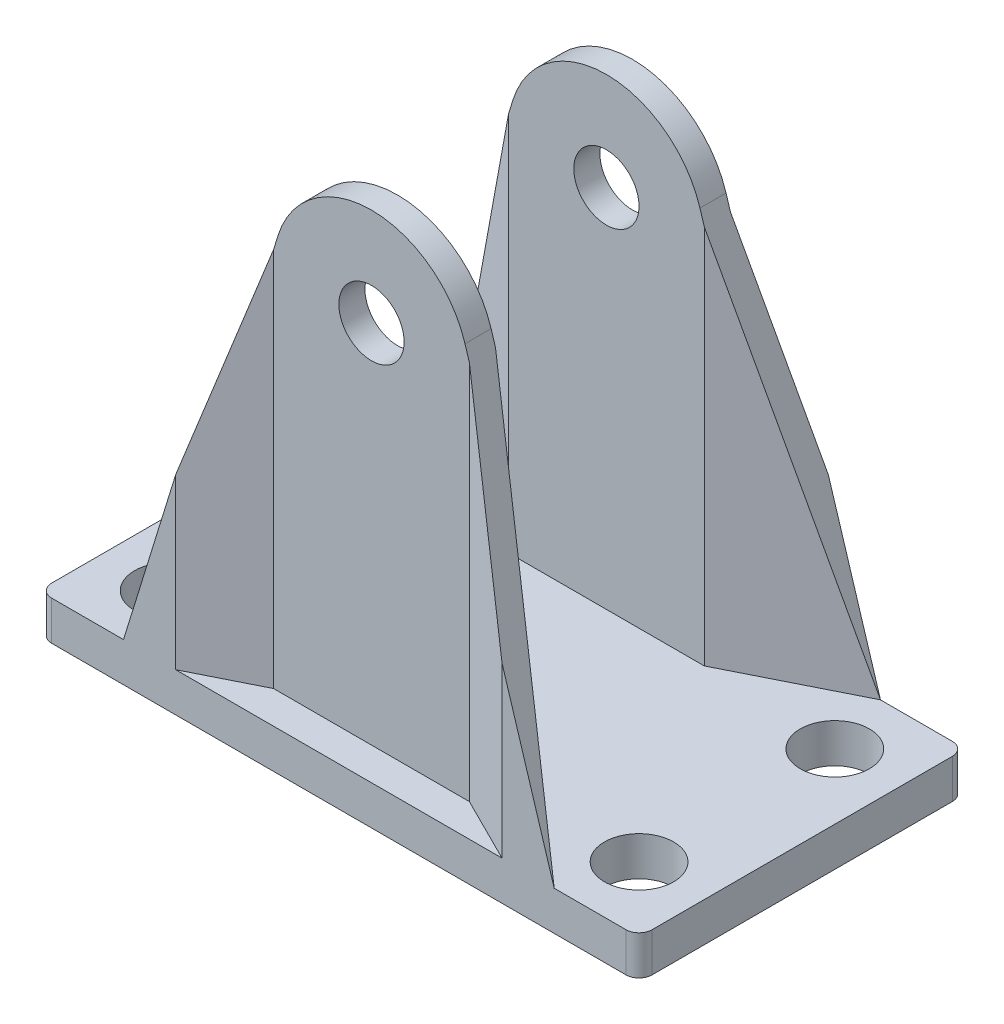
ISO-10303-21;
HEADER;
FILE_DESCRIPTION(('STEP AP214'),'2;1');
FILE_NAME('part.step','',(''),(''),'','','');
FILE_SCHEMA(('AUTOMOTIVE_DESIGN { 1 0 10303 214 1 1 1 1 }'));
ENDSEC;
DATA;
#1=APPLICATION_CONTEXT('core data for automotive mechanical design processes');
#2=APPLICATION_PROTOCOL_DEFINITION('international standard','automotive_design',2000,#1);
#3=PRODUCT_CONTEXT('',#1,'mechanical');
#4=PRODUCT('Part','Part','',(#3));
#5=PRODUCT_RELATED_PRODUCT_CATEGORY('part','',(#4));
#6=PRODUCT_DEFINITION_FORMATION('','',#4);
#7=PRODUCT_DEFINITION_CONTEXT('part definition',#1,'design');
#8=PRODUCT_DEFINITION('design','',#6,#7);
#9=PRODUCT_DEFINITION_SHAPE('','',#8);
#10=(LENGTH_UNIT() NAMED_UNIT(*) SI_UNIT(.MILLI.,.METRE.));
#11=(NAMED_UNIT(*) PLANE_ANGLE_UNIT() SI_UNIT($,.RADIAN.));
#12=(NAMED_UNIT(*) SI_UNIT($,.STERADIAN.) SOLID_ANGLE_UNIT());
#13=UNCERTAINTY_MEASURE_WITH_UNIT(LENGTH_MEASURE(1.E-05),#10,'distance_accuracy_value','');
#14=(GEOMETRIC_REPRESENTATION_CONTEXT(3) GLOBAL_UNCERTAINTY_ASSIGNED_CONTEXT((#13)) GLOBAL_UNIT_ASSIGNED_CONTEXT((#10,
#11,#12)) REPRESENTATION_CONTEXT('',''));
#15=CARTESIAN_POINT('',(0.,0.,0.));
#16=DIRECTION('',(0.,0.,1.));
#17=DIRECTION('',(1.,0.,0.));
#18=AXIS2_PLACEMENT_3D('',#15,#16,#17);
#19=CARTESIAN_POINT('',(-23.,1.5,12.5));
#20=DIRECTION('',(0.,0.,-1.));
#21=DIRECTION('',(1.,0.,0.));
#22=AXIS2_PLACEMENT_3D('',#19,#20,#21);
#23=PLANE('',#22);
#24=DIRECTION('',(-0.295172368215651,0.955444018790198,0.));
#25=VECTOR('',#24,1.);
#26=CARTESIAN_POINT('',(13.0584942851576,12.6398166120894,12.5));
#27=LINE('',#26,#25);
#28=CARTESIAN_POINT('',(16.5,1.5,12.5));
#29=VERTEX_POINT('',#28);
#30=CARTESIAN_POINT('',(12.5,14.4476078613449,12.5));
#31=VERTEX_POINT('',#30);
#32=EDGE_CURVE('E288',#29,#31,#27,.T.);
#33=ORIENTED_EDGE('',*,*,#32,.T.);
#34=DIRECTION('',(0.,-1.,0.));
#35=VECTOR('',#34,1.);
#36=CARTESIAN_POINT('',(12.5,51.5,12.5));
#37=LINE('',#36,#35);
#38=CARTESIAN_POINT('',(12.5,1.5,12.5));
#39=VERTEX_POINT('',#38);
#40=EDGE_CURVE('E344',#31,#39,#37,.T.);
#41=ORIENTED_EDGE('',*,*,#40,.T.);
#42=DIRECTION('',(-1.,0.,0.));
#43=VECTOR('',#42,1.);
#44=CARTESIAN_POINT('',(-23.,1.5,12.5));
#45=LINE('',#44,#43);
#46=CARTESIAN_POINT('',(-12.5,1.5,12.5));
#47=VERTEX_POINT('',#46);
#48=EDGE_CURVE('E250',#39,#47,#45,.T.);
#49=ORIENTED_EDGE('',*,*,#48,.T.);
#50=DIRECTION('',(0.,-1.,0.));
#51=VECTOR('',#50,1.);
#52=CARTESIAN_POINT('',(-12.5,51.5,12.5));
#53=LINE('',#52,#51);
#54=CARTESIAN_POINT('',(-12.5,14.447607861345,12.5));
#55=VERTEX_POINT('',#54);
#56=EDGE_CURVE('E257',#55,#47,#53,.T.);
#57=ORIENTED_EDGE('',*,*,#56,.F.);
#58=DIRECTION('',(0.295172368215653,0.955444018790197,0.));
#59=VECTOR('',#58,1.);
#60=CARTESIAN_POINT('',(-17.0663237252272,-0.333134379204587,12.5));
#61=LINE('',#60,#59);
#62=CARTESIAN_POINT('',(-16.5,1.5,12.5));
#63=VERTEX_POINT('',#62);
#64=EDGE_CURVE('E222',#63,#55,#61,.T.);
#65=ORIENTED_EDGE('',*,*,#64,.F.);
#66=CARTESIAN_POINT('',(-22.,1.5,12.5));
#67=VERTEX_POINT('',#66);
#68=EDGE_CURVE('E241',#63,#67,#45,.T.);
#69=ORIENTED_EDGE('',*,*,#68,.T.);
#70=DIRECTION('',(0.,-1.,0.));
#71=VECTOR('',#70,1.);
#72=CARTESIAN_POINT('',(-22.,1.5,12.5));
#73=LINE('',#72,#71);
#74=CARTESIAN_POINT('',(-22.,-1.5,12.5));
#75=VERTEX_POINT('',#74);
#76=EDGE_CURVE('E433',#75,#67,#73,.F.);
#77=ORIENTED_EDGE('',*,*,#76,.F.);
#78=DIRECTION('',(-1.,0.,0.));
#79=VECTOR('',#78,1.);
#80=CARTESIAN_POINT('',(-23.,-1.5,12.5));
#81=LINE('',#80,#79);
#82=CARTESIAN_POINT('',(22.,-1.5,12.5));
#83=VERTEX_POINT('',#82);
#84=EDGE_CURVE('E391',#83,#75,#81,.T.);
#85=ORIENTED_EDGE('',*,*,#84,.F.);
#86=DIRECTION('',(0.,-1.,0.));
#87=VECTOR('',#86,1.);
#88=CARTESIAN_POINT('',(22.,1.5,12.5));
#89=LINE('',#88,#87);
#90=CARTESIAN_POINT('',(22.,1.5,12.5));
#91=VERTEX_POINT('',#90);
#92=EDGE_CURVE('E430',#91,#83,#89,.T.);
#93=ORIENTED_EDGE('',*,*,#92,.F.);
#94=EDGE_CURVE('E253',#91,#29,#45,.T.);
#95=ORIENTED_EDGE('',*,*,#94,.T.);
#96=EDGE_LOOP('',(#33,#41,#49,#57,#65,#69,#77,#85,#93,#95));
#97=FACE_BOUND('',#96,.T.);
#98=ADVANCED_FACE('F45',(#97),#23,.F.);
#99=CARTESIAN_POINT('',(-23.,1.5,-12.5));
#100=DIRECTION('',(0.,0.,1.));
#101=DIRECTION('',(-1.,0.,0.));
#102=AXIS2_PLACEMENT_3D('',#99,#100,#101);
#103=PLANE('',#102);
#104=DIRECTION('',(0.295172368215651,-0.955444018790198,0.));
#105=VECTOR('',#104,1.);
#106=CARTESIAN_POINT('',(13.0584942851576,12.6398166120894,-12.5));
#107=LINE('',#106,#105);
#108=CARTESIAN_POINT('',(12.5,14.447607861345,-12.5));
#109=VERTEX_POINT('',#108);
#110=CARTESIAN_POINT('',(16.5,1.5,-12.5));
#111=VERTEX_POINT('',#110);
#112=EDGE_CURVE('E276',#109,#111,#107,.T.);
#113=ORIENTED_EDGE('',*,*,#112,.T.);
#114=DIRECTION('',(1.,0.,0.));
#115=VECTOR('',#114,1.);
#116=CARTESIAN_POINT('',(-23.,1.5,-12.5));
#117=LINE('',#116,#115);
#118=CARTESIAN_POINT('',(22.,1.5,-12.5));
#119=VERTEX_POINT('',#118);
#120=EDGE_CURVE('E383',#111,#119,#117,.T.);
#121=ORIENTED_EDGE('',*,*,#120,.T.);
#122=DIRECTION('',(0.,-1.,0.));
#123=VECTOR('',#122,1.);
#124=CARTESIAN_POINT('',(22.,1.5,-12.5));
#125=LINE('',#124,#123);
#126=CARTESIAN_POINT('',(22.,-1.5,-12.5));
#127=VERTEX_POINT('',#126);
#128=EDGE_CURVE('E415',#127,#119,#125,.F.);
#129=ORIENTED_EDGE('',*,*,#128,.F.);
#130=DIRECTION('',(1.,0.,0.));
#131=VECTOR('',#130,1.);
#132=CARTESIAN_POINT('',(-23.,-1.5,-12.5));
#133=LINE('',#132,#131);
#134=CARTESIAN_POINT('',(-22.,-1.5,-12.5));
#135=VERTEX_POINT('',#134);
#136=EDGE_CURVE('E377',#135,#127,#133,.T.);
#137=ORIENTED_EDGE('',*,*,#136,.F.);
#138=DIRECTION('',(0.,-1.,0.));
#139=VECTOR('',#138,1.);
#140=CARTESIAN_POINT('',(-22.,1.5,-12.5));
#141=LINE('',#140,#139);
#142=CARTESIAN_POINT('',(-22.,1.5,-12.5));
#143=VERTEX_POINT('',#142);
#144=EDGE_CURVE('E412',#143,#135,#141,.T.);
#145=ORIENTED_EDGE('',*,*,#144,.F.);
#146=CARTESIAN_POINT('',(-16.5,1.5,-12.5));
#147=VERTEX_POINT('',#146);
#148=EDGE_CURVE('E384',#143,#147,#117,.T.);
#149=ORIENTED_EDGE('',*,*,#148,.T.);
#150=DIRECTION('',(-0.295172368215653,-0.955444018790197,0.));
#151=VECTOR('',#150,1.);
#152=CARTESIAN_POINT('',(-17.0663237252272,-0.333134379204587,-12.5));
#153=LINE('',#152,#151);
#154=CARTESIAN_POINT('',(-12.5,14.447607861345,-12.5));
#155=VERTEX_POINT('',#154);
#156=EDGE_CURVE('E475',#155,#147,#153,.T.);
#157=ORIENTED_EDGE('',*,*,#156,.F.);
#158=DIRECTION('',(0.,-1.,0.));
#159=VECTOR('',#158,1.);
#160=CARTESIAN_POINT('',(-12.5,51.5,-12.5));
#161=LINE('',#160,#159);
#162=CARTESIAN_POINT('',(-12.5,1.5,-12.5));
#163=VERTEX_POINT('',#162);
#164=EDGE_CURVE('E238',#155,#163,#161,.T.);
#165=ORIENTED_EDGE('',*,*,#164,.T.);
#166=CARTESIAN_POINT('',(12.5,1.5,-12.5));
#167=VERTEX_POINT('',#166);
#168=EDGE_CURVE('E388',#163,#167,#117,.T.);
#169=ORIENTED_EDGE('',*,*,#168,.T.);
#170=DIRECTION('',(0.,-1.,0.));
#171=VECTOR('',#170,1.);
#172=CARTESIAN_POINT('',(12.5,51.5,-12.5));
#173=LINE('',#172,#171);
#174=EDGE_CURVE('E317',#109,#167,#173,.T.);
#175=ORIENTED_EDGE('',*,*,#174,.F.);
#176=EDGE_LOOP('',(#113,#121,#129,#137,#145,#149,#157,#165,#169,#175));
#177=FACE_BOUND('',#176,.T.);
#178=ADVANCED_FACE('F460',(#177),#103,.F.);
#179=CARTESIAN_POINT('',(0.,51.5,8.));
#180=DIRECTION('',(0.,0.,1.));
#181=DIRECTION('',(-1.,0.,0.));
#182=AXIS2_PLACEMENT_3D('',#179,#180,#181);
#183=PLANE('',#182);
#184=CARTESIAN_POINT('',(0.,29.5,8.));
#185=DIRECTION('',(0.,0.,-1.));
#186=DIRECTION('',(-1.,0.,0.));
#187=AXIS2_PLACEMENT_3D('',#184,#185,#186);
#188=CIRCLE('',#187,2.5);
#189=CARTESIAN_POINT('',(-2.5,29.5,8.));
#190=VERTEX_POINT('',#189);
#191=EDGE_CURVE('E485',#190,#190,#188,.T.);
#192=ORIENTED_EDGE('',*,*,#191,.F.);
#193=EDGE_LOOP('',(#192));
#194=FACE_BOUND('',#193,.T.);
#195=DIRECTION('',(0.295172368215651,-0.955444018790198,0.));
#196=VECTOR('',#195,1.);
#197=CARTESIAN_POINT('',(0.96137531900328,51.7970047685406,8.));
#198=LINE('',#197,#196);
#199=CARTESIAN_POINT('',(7.16583014092648,31.7137927616174,8.));
#200=VERTEX_POINT('',#199);
#201=CARTESIAN_POINT('',(7.5,30.6321176880262,8.));
#202=VERTEX_POINT('',#201);
#203=EDGE_CURVE('E293',#200,#202,#198,.T.);
#204=ORIENTED_EDGE('',*,*,#203,.T.);
#205=DIRECTION('',(0.,-1.,0.));
#206=VECTOR('',#205,1.);
#207=CARTESIAN_POINT('',(7.5,51.5,8.));
#208=LINE('',#207,#206);
#209=CARTESIAN_POINT('',(7.5,1.5,8.));
#210=VERTEX_POINT('',#209);
#211=EDGE_CURVE('E347',#202,#210,#208,.T.);
#212=ORIENTED_EDGE('',*,*,#211,.T.);
#213=DIRECTION('',(1.,0.,0.));
#214=VECTOR('',#213,1.);
#215=CARTESIAN_POINT('',(0.,1.5,8.));
#216=LINE('',#215,#214);
#217=CARTESIAN_POINT('',(-7.5,1.5,8.));
#218=VERTEX_POINT('',#217);
#219=EDGE_CURVE('E237',#218,#210,#216,.T.);
#220=ORIENTED_EDGE('',*,*,#219,.F.);
#221=DIRECTION('',(0.,-1.,0.));
#222=VECTOR('',#221,1.);
#223=CARTESIAN_POINT('',(-7.5,51.5,8.));
#224=LINE('',#223,#222);
#225=CARTESIAN_POINT('',(-7.5,30.6321176880262,8.));
#226=VERTEX_POINT('',#225);
#227=EDGE_CURVE('E233',#226,#218,#224,.T.);
#228=ORIENTED_EDGE('',*,*,#227,.F.);
#229=DIRECTION('',(-0.295172368215653,-0.955444018790197,0.));
#230=VECTOR('',#229,1.);
#231=CARTESIAN_POINT('',(-0.96137531900325,51.7970047685406,8.));
#232=LINE('',#231,#230);
#233=CARTESIAN_POINT('',(-7.16583014092648,31.7137927616174,8.));
#234=VERTEX_POINT('',#233);
#235=EDGE_CURVE('E225',#234,#226,#232,.T.);
#236=ORIENTED_EDGE('',*,*,#235,.F.);
#237=CARTESIAN_POINT('',(0.,29.5,8.));
#238=DIRECTION('',(0.,0.,-1.));
#239=DIRECTION('',(-1.,0.,0.));
#240=AXIS2_PLACEMENT_3D('',#237,#238,#239);
#241=CIRCLE('',#240,7.5);
#242=EDGE_CURVE('E271',#234,#200,#241,.T.);
#243=ORIENTED_EDGE('',*,*,#242,.T.);
#244=EDGE_LOOP('',(#204,#212,#220,#228,#236,#243));
#245=FACE_BOUND('',#244,.T.);
#246=ADVANCED_FACE('F518',(#194,#245),#183,.F.);
#247=CARTESIAN_POINT('',(-1.7,51.5,3.4));
#248=DIRECTION('',(-0.447213595499958,0.,0.894427190999916));
#249=DIRECTION('',(-0.894427190999916,0.,-0.447213595499958));
#250=AXIS2_PLACEMENT_3D('',#247,#248,#249);
#251=PLANE('',#250);
#252=DIRECTION('',(0.292009273283408,-0.945205390587474,0.146004636641704));
#253=VECTOR('',#252,1.);
#254=CARTESIAN_POINT('',(0.759683832749848,52.4498603367859,4.62984191637492));
#255=LINE('',#254,#253);
#256=EDGE_CURVE('E290',#202,#29,#255,.T.);
#257=ORIENTED_EDGE('',*,*,#256,.T.);
#258=DIRECTION('',(0.894427190999916,0.,0.447213595499958));
#259=VECTOR('',#258,1.);
#260=CARTESIAN_POINT('',(-1.7,1.5,3.4));
#261=LINE('',#260,#259);
#262=EDGE_CURVE('E329',#210,#29,#261,.T.);
#263=ORIENTED_EDGE('',*,*,#262,.F.);
#264=ORIENTED_EDGE('',*,*,#211,.F.);
#265=EDGE_LOOP('',(#257,#263,#264));
#266=FACE_BOUND('',#265,.T.);
#267=ADVANCED_FACE('F616',(#266),#251,.F.);
#268=CARTESIAN_POINT('',(-2.5,51.5,5.));
#269=DIRECTION('',(-0.447213595499958,0.,0.894427190999916));
#270=DIRECTION('',(-0.894427190999916,0.,-0.447213595499958));
#271=AXIS2_PLACEMENT_3D('',#268,#269,#270);
#272=PLANE('',#271);
#273=DIRECTION('',(0.,-1.,0.));
#274=VECTOR('',#273,1.);
#275=CARTESIAN_POINT('',(7.5,51.5,10.));
#276=LINE('',#275,#274);
#277=CARTESIAN_POINT('',(7.5,30.6321176880262,10.));
#278=VERTEX_POINT('',#277);
#279=CARTESIAN_POINT('',(7.5,1.5,10.));
#280=VERTEX_POINT('',#279);
#281=EDGE_CURVE('E341',#278,#280,#276,.T.);
#282=ORIENTED_EDGE('',*,*,#281,.T.);
#283=DIRECTION('',(0.894427190999916,0.,0.447213595499958));
#284=VECTOR('',#283,1.);
#285=CARTESIAN_POINT('',(-2.5,1.5,5.));
#286=LINE('',#285,#284);
#287=EDGE_CURVE('E331',#280,#39,#286,.T.);
#288=ORIENTED_EDGE('',*,*,#287,.T.);
#289=ORIENTED_EDGE('',*,*,#40,.F.);
#290=DIRECTION('',(0.292009273283408,-0.945205390587474,0.146004636641704));
#291=VECTOR('',#290,1.);
#292=CARTESIAN_POINT('',(0.674414417066342,52.7258690759949,6.58720720853317));
#293=LINE('',#292,#291);
#294=EDGE_CURVE('E286',#278,#31,#293,.T.);
#295=ORIENTED_EDGE('',*,*,#294,.F.);
#296=EDGE_LOOP('',(#282,#288,#289,#295));
#297=FACE_BOUND('',#296,.T.);
#298=ADVANCED_FACE('F620',(#297),#272,.T.);
#299=CARTESIAN_POINT('',(0.,51.5,10.));
#300=DIRECTION('',(0.,0.,1.));
#301=DIRECTION('',(-1.,0.,0.));
#302=AXIS2_PLACEMENT_3D('',#299,#300,#301);
#303=PLANE('',#302);
#304=CARTESIAN_POINT('',(0.,29.5,10.));
#305=DIRECTION('',(0.,0.,-1.));
#306=DIRECTION('',(-1.,0.,0.));
#307=AXIS2_PLACEMENT_3D('',#304,#305,#306);
#308=CIRCLE('',#307,2.5);
#309=CARTESIAN_POINT('',(-2.5,29.5,10.));
#310=VERTEX_POINT('',#309);
#311=EDGE_CURVE('E489',#310,#310,#308,.T.);
#312=ORIENTED_EDGE('',*,*,#311,.T.);
#313=EDGE_LOOP('',(#312));
#314=FACE_BOUND('',#313,.T.);
#315=CARTESIAN_POINT('',(0.,29.5,10.));
#316=DIRECTION('',(0.,0.,-1.));
#317=DIRECTION('',(-1.,0.,0.));
#318=AXIS2_PLACEMENT_3D('',#315,#316,#317);
#319=CIRCLE('',#318,7.5);
#320=CARTESIAN_POINT('',(-7.16583014092648,31.7137927616174,10.));
#321=VERTEX_POINT('',#320);
#322=CARTESIAN_POINT('',(7.16583014092648,31.7137927616174,10.));
#323=VERTEX_POINT('',#322);
#324=EDGE_CURVE('E268',#321,#323,#319,.T.);
#325=ORIENTED_EDGE('',*,*,#324,.F.);
#326=DIRECTION('',(-0.295172368215653,-0.955444018790197,0.));
#327=VECTOR('',#326,1.);
#328=CARTESIAN_POINT('',(-0.96137531900325,51.7970047685406,10.));
#329=LINE('',#328,#327);
#330=CARTESIAN_POINT('',(-7.5,30.6321176880262,10.));
#331=VERTEX_POINT('',#330);
#332=EDGE_CURVE('E258',#321,#331,#329,.T.);
#333=ORIENTED_EDGE('',*,*,#332,.T.);
#334=DIRECTION('',(0.,-1.,0.));
#335=VECTOR('',#334,1.);
#336=CARTESIAN_POINT('',(-7.5,51.5,10.));
#337=LINE('',#336,#335);
#338=CARTESIAN_POINT('',(-7.5,1.5,10.));
#339=VERTEX_POINT('',#338);
#340=EDGE_CURVE('E338',#331,#339,#337,.T.);
#341=ORIENTED_EDGE('',*,*,#340,.T.);
#342=DIRECTION('',(1.,0.,0.));
#343=VECTOR('',#342,1.);
#344=CARTESIAN_POINT('',(0.,1.5,10.));
#345=LINE('',#344,#343);
#346=EDGE_CURVE('E333',#339,#280,#345,.T.);
#347=ORIENTED_EDGE('',*,*,#346,.T.);
#348=ORIENTED_EDGE('',*,*,#281,.F.);
#349=DIRECTION('',(0.295172368215651,-0.955444018790198,0.));
#350=VECTOR('',#349,1.);
#351=CARTESIAN_POINT('',(0.96137531900328,51.7970047685406,10.));
#352=LINE('',#351,#350);
#353=EDGE_CURVE('E284',#323,#278,#352,.T.);
#354=ORIENTED_EDGE('',*,*,#353,.F.);
#355=EDGE_LOOP('',(#325,#333,#341,#347,#348,#354));
#356=FACE_BOUND('',#355,.T.);
#357=ADVANCED_FACE('F624',(#314,#356),#303,.T.);
#358=CARTESIAN_POINT('',(0.,51.5,-10.));
#359=DIRECTION('',(0.,0.,1.));
#360=DIRECTION('',(-1.,0.,0.));
#361=AXIS2_PLACEMENT_3D('',#358,#359,#360);
#362=PLANE('',#361);
#363=CARTESIAN_POINT('',(0.,29.5,-10.));
#364=DIRECTION('',(0.,0.,-1.));
#365=DIRECTION('',(-1.,0.,0.));
#366=AXIS2_PLACEMENT_3D('',#363,#364,#365);
#367=CIRCLE('',#366,2.5);
#368=CARTESIAN_POINT('',(-2.5,29.5,-10.));
#369=VERTEX_POINT('',#368);
#370=EDGE_CURVE('E492',#369,#369,#367,.T.);
#371=ORIENTED_EDGE('',*,*,#370,.F.);
#372=EDGE_LOOP('',(#371));
#373=FACE_BOUND('',#372,.T.);
#374=DIRECTION('',(0.295172368215651,-0.955444018790198,0.));
#375=VECTOR('',#374,1.);
#376=CARTESIAN_POINT('',(0.96137531900328,51.7970047685406,-10.));
#377=LINE('',#376,#375);
#378=CARTESIAN_POINT('',(7.16583014092648,31.7137927616174,-10.));
#379=VERTEX_POINT('',#378);
#380=CARTESIAN_POINT('',(7.5,30.6321176880262,-10.));
#381=VERTEX_POINT('',#380);
#382=EDGE_CURVE('E281',#379,#381,#377,.T.);
#383=ORIENTED_EDGE('',*,*,#382,.T.);
#384=DIRECTION('',(0.,-1.,0.));
#385=VECTOR('',#384,1.);
#386=CARTESIAN_POINT('',(7.5,51.5,-10.));
#387=LINE('',#386,#385);
#388=CARTESIAN_POINT('',(7.5,1.5,-10.));
#389=VERTEX_POINT('',#388);
#390=EDGE_CURVE('E320',#381,#389,#387,.T.);
#391=ORIENTED_EDGE('',*,*,#390,.T.);
#392=DIRECTION('',(1.,0.,0.));
#393=VECTOR('',#392,1.);
#394=CARTESIAN_POINT('',(0.,1.5,-10.));
#395=LINE('',#394,#393);
#396=CARTESIAN_POINT('',(-7.5,1.5,-10.));
#397=VERTEX_POINT('',#396);
#398=EDGE_CURVE('E301',#397,#389,#395,.T.);
#399=ORIENTED_EDGE('',*,*,#398,.F.);
#400=DIRECTION('',(0.,-1.,0.));
#401=VECTOR('',#400,1.);
#402=CARTESIAN_POINT('',(-7.5,51.5,-10.));
#403=LINE('',#402,#401);
#404=CARTESIAN_POINT('',(-7.5,30.6321176880262,-10.));
#405=VERTEX_POINT('',#404);
#406=EDGE_CURVE('E323',#405,#397,#403,.T.);
#407=ORIENTED_EDGE('',*,*,#406,.F.);
#408=DIRECTION('',(-0.295172368215653,-0.955444018790197,0.));
#409=VECTOR('',#408,1.);
#410=CARTESIAN_POINT('',(-0.96137531900325,51.7970047685406,-10.));
#411=LINE('',#410,#409);
#412=CARTESIAN_POINT('',(-7.16583014092648,31.7137927616174,-10.));
#413=VERTEX_POINT('',#412);
#414=EDGE_CURVE('E471',#413,#405,#411,.T.);
#415=ORIENTED_EDGE('',*,*,#414,.F.);
#416=CARTESIAN_POINT('',(0.,29.5,-10.));
#417=DIRECTION('',(0.,0.,-1.));
#418=DIRECTION('',(-1.,0.,0.));
#419=AXIS2_PLACEMENT_3D('',#416,#417,#418);
#420=CIRCLE('',#419,7.5);
#421=EDGE_CURVE('E265',#413,#379,#420,.T.);
#422=ORIENTED_EDGE('',*,*,#421,.T.);
#423=EDGE_LOOP('',(#383,#391,#399,#407,#415,#422));
#424=FACE_BOUND('',#423,.T.);
#425=ADVANCED_FACE('F467',(#373,#424),#362,.F.);
#426=CARTESIAN_POINT('',(-2.5,51.5,-5.));
#427=DIRECTION('',(0.447213595499958,0.,0.894427190999916));
#428=DIRECTION('',(-0.894427190999916,0.,0.447213595499958));
#429=AXIS2_PLACEMENT_3D('',#426,#427,#428);
#430=PLANE('',#429);
#431=DIRECTION('',(0.292009273283408,-0.945205390587474,-0.146004636641704));
#432=VECTOR('',#431,1.);
#433=CARTESIAN_POINT('',(0.674414417066342,52.7258690759949,-6.58720720853317));
#434=LINE('',#433,#432);
#435=EDGE_CURVE('E279',#381,#109,#434,.T.);
#436=ORIENTED_EDGE('',*,*,#435,.T.);
#437=ORIENTED_EDGE('',*,*,#174,.T.);
#438=DIRECTION('',(0.894427190999916,0.,-0.447213595499958));
#439=VECTOR('',#438,1.);
#440=CARTESIAN_POINT('',(-2.5,1.5,-5.));
#441=LINE('',#440,#439);
#442=EDGE_CURVE('E304',#389,#167,#441,.T.);
#443=ORIENTED_EDGE('',*,*,#442,.F.);
#444=ORIENTED_EDGE('',*,*,#390,.F.);
#445=EDGE_LOOP('',(#436,#437,#443,#444));
#446=FACE_BOUND('',#445,.T.);
#447=ADVANCED_FACE('F464',(#446),#430,.F.);
#448=CARTESIAN_POINT('',(-1.7,51.5,-3.4));
#449=DIRECTION('',(0.447213595499958,0.,0.894427190999916));
#450=DIRECTION('',(-0.894427190999916,0.,0.447213595499958));
#451=AXIS2_PLACEMENT_3D('',#448,#449,#450);
#452=PLANE('',#451);
#453=DIRECTION('',(0.,-1.,0.));
#454=VECTOR('',#453,1.);
#455=CARTESIAN_POINT('',(7.5,51.5,-8.));
#456=LINE('',#455,#454);
#457=CARTESIAN_POINT('',(7.5,30.6321176880262,-8.));
#458=VERTEX_POINT('',#457);
#459=CARTESIAN_POINT('',(7.5,1.5,-8.));
#460=VERTEX_POINT('',#459);
#461=EDGE_CURVE('E314',#458,#460,#456,.T.);
#462=ORIENTED_EDGE('',*,*,#461,.T.);
#463=DIRECTION('',(0.894427190999916,0.,-0.447213595499958));
#464=VECTOR('',#463,1.);
#465=CARTESIAN_POINT('',(-1.7,1.5,-3.4));
#466=LINE('',#465,#464);
#467=EDGE_CURVE('E306',#460,#111,#466,.T.);
#468=ORIENTED_EDGE('',*,*,#467,.T.);
#469=DIRECTION('',(0.292009273283408,-0.945205390587474,-0.146004636641704));
#470=VECTOR('',#469,1.);
#471=CARTESIAN_POINT('',(0.759683832749848,52.4498603367859,-4.62984191637492));
#472=LINE('',#471,#470);
#473=EDGE_CURVE('E274',#458,#111,#472,.T.);
#474=ORIENTED_EDGE('',*,*,#473,.F.);
#475=EDGE_LOOP('',(#462,#468,#474));
#476=FACE_BOUND('',#475,.T.);
#477=ADVANCED_FACE('F451',(#476),#452,.T.);
#478=CARTESIAN_POINT('',(0.,51.5,-8.));
#479=DIRECTION('',(0.,0.,1.));
#480=DIRECTION('',(-1.,0.,0.));
#481=AXIS2_PLACEMENT_3D('',#478,#479,#480);
#482=PLANE('',#481);
#483=CARTESIAN_POINT('',(0.,29.5,-8.));
#484=DIRECTION('',(0.,0.,-1.));
#485=DIRECTION('',(-1.,0.,0.));
#486=AXIS2_PLACEMENT_3D('',#483,#484,#485);
#487=CIRCLE('',#486,2.5);
#488=CARTESIAN_POINT('',(-2.5,29.5,-8.));
#489=VERTEX_POINT('',#488);
#490=EDGE_CURVE('E49',#489,#489,#487,.T.);
#491=ORIENTED_EDGE('',*,*,#490,.T.);
#492=EDGE_LOOP('',(#491));
#493=FACE_BOUND('',#492,.T.);
#494=CARTESIAN_POINT('',(0.,29.5,-8.));
#495=DIRECTION('',(0.,0.,-1.));
#496=DIRECTION('',(-1.,0.,0.));
#497=AXIS2_PLACEMENT_3D('',#494,#495,#496);
#498=CIRCLE('',#497,7.5);
#499=CARTESIAN_POINT('',(-7.16583014092648,31.7137927616174,-8.));
#500=VERTEX_POINT('',#499);
#501=CARTESIAN_POINT('',(7.16583014092648,31.7137927616174,-8.));
#502=VERTEX_POINT('',#501);
#503=EDGE_CURVE('E54',#500,#502,#498,.T.);
#504=ORIENTED_EDGE('',*,*,#503,.F.);
#505=DIRECTION('',(-0.295172368215653,-0.955444018790197,0.));
#506=VECTOR('',#505,1.);
#507=CARTESIAN_POINT('',(-0.96137531900325,51.7970047685406,-8.));
#508=LINE('',#507,#506);
#509=CARTESIAN_POINT('',(-7.5,30.6321176880262,-8.));
#510=VERTEX_POINT('',#509);
#511=EDGE_CURVE('E435',#500,#510,#508,.T.);
#512=ORIENTED_EDGE('',*,*,#511,.T.);
#513=DIRECTION('',(0.,-1.,0.));
#514=VECTOR('',#513,1.);
#515=CARTESIAN_POINT('',(-7.5,51.5,-8.));
#516=LINE('',#515,#514);
#517=CARTESIAN_POINT('',(-7.5,1.5,-8.));
#518=VERTEX_POINT('',#517);
#519=EDGE_CURVE('E311',#510,#518,#516,.T.);
#520=ORIENTED_EDGE('',*,*,#519,.T.);
#521=DIRECTION('',(1.,0.,0.));
#522=VECTOR('',#521,1.);
#523=CARTESIAN_POINT('',(0.,1.5,-8.));
#524=LINE('',#523,#522);
#525=EDGE_CURVE('E309',#518,#460,#524,.T.);
#526=ORIENTED_EDGE('',*,*,#525,.T.);
#527=ORIENTED_EDGE('',*,*,#461,.F.);
#528=DIRECTION('',(0.295172368215651,-0.955444018790198,0.));
#529=VECTOR('',#528,1.);
#530=CARTESIAN_POINT('',(0.96137531900328,51.7970047685406,-8.));
#531=LINE('',#530,#529);
#532=EDGE_CURVE('E11',#502,#458,#531,.T.);
#533=ORIENTED_EDGE('',*,*,#532,.F.);
#534=EDGE_LOOP('',(#504,#512,#520,#526,#527,#533));
#535=FACE_BOUND('',#534,.T.);
#536=ADVANCED_FACE('F443',(#493,#535),#482,.T.);
#537=CARTESIAN_POINT('',(0.,1.5,0.));
#538=DIRECTION('',(0.,-1.,0.));
#539=DIRECTION('',(0.,0.,1.));
#540=AXIS2_PLACEMENT_3D('',#537,#538,#539);
#541=PLANE('',#540);
#542=CARTESIAN_POINT('',(18.,1.5,7.5));
#543=DIRECTION('',(0.,-1.,0.));
#544=DIRECTION('',(0.,0.,-1.));
#545=AXIS2_PLACEMENT_3D('',#542,#543,#544);
#546=CIRCLE('',#545,2.65);
#547=CARTESIAN_POINT('',(18.,1.5,4.85));
#548=VERTEX_POINT('',#547);
#549=EDGE_CURVE('E364',#548,#548,#546,.T.);
#550=ORIENTED_EDGE('',*,*,#549,.T.);
#551=EDGE_LOOP('',(#550));
#552=FACE_BOUND('',#551,.T.);
#553=CARTESIAN_POINT('',(18.,1.5,-7.5));
#554=DIRECTION('',(0.,-1.,0.));
#555=DIRECTION('',(0.,0.,-1.));
#556=AXIS2_PLACEMENT_3D('',#553,#554,#555);
#557=CIRCLE('',#556,2.65);
#558=CARTESIAN_POINT('',(18.,1.5,-10.15));
#559=VERTEX_POINT('',#558);
#560=EDGE_CURVE('E352',#559,#559,#557,.T.);
#561=ORIENTED_EDGE('',*,*,#560,.T.);
#562=EDGE_LOOP('',(#561));
#563=FACE_BOUND('',#562,.T.);
#564=CARTESIAN_POINT('',(-18.,1.5,-7.5));
#565=DIRECTION('',(0.,-1.,0.));
#566=DIRECTION('',(0.,0.,-1.));
#567=AXIS2_PLACEMENT_3D('',#564,#565,#566);
#568=CIRCLE('',#567,2.65);
#569=CARTESIAN_POINT('',(-18.,1.5,-10.15));
#570=VERTEX_POINT('',#569);
#571=EDGE_CURVE('E358',#570,#570,#568,.T.);
#572=ORIENTED_EDGE('',*,*,#571,.T.);
#573=EDGE_LOOP('',(#572));
#574=FACE_BOUND('',#573,.T.);
#575=CARTESIAN_POINT('',(-18.,1.5,7.5));
#576=DIRECTION('',(0.,-1.,0.));
#577=DIRECTION('',(0.,0.,-1.));
#578=AXIS2_PLACEMENT_3D('',#575,#576,#577);
#579=CIRCLE('',#578,2.65);
#580=CARTESIAN_POINT('',(-18.,1.5,4.85));
#581=VERTEX_POINT('',#580);
#582=EDGE_CURVE('E370',#581,#581,#579,.T.);
#583=ORIENTED_EDGE('',*,*,#582,.T.);
#584=EDGE_LOOP('',(#583));
#585=FACE_BOUND('',#584,.T.);
#586=ORIENTED_EDGE('',*,*,#148,.F.);
#587=CARTESIAN_POINT('',(-22.,1.5,-11.5));
#588=DIRECTION('',(0.,1.,0.));
#589=DIRECTION('',(0.,0.,1.));
#590=AXIS2_PLACEMENT_3D('',#587,#588,#589);
#591=CIRCLE('',#590,1.);
#592=CARTESIAN_POINT('',(-23.,1.5,-11.5));
#593=VERTEX_POINT('',#592);
#594=EDGE_CURVE('E418',#593,#143,#591,.F.);
#595=ORIENTED_EDGE('',*,*,#594,.F.);
#596=DIRECTION('',(0.,0.,-1.));
#597=VECTOR('',#596,1.);
#598=CARTESIAN_POINT('',(-23.,1.5,-12.5));
#599=LINE('',#598,#597);
#600=CARTESIAN_POINT('',(-23.,1.5,11.5));
#601=VERTEX_POINT('',#600);
#602=EDGE_CURVE('E380',#601,#593,#599,.T.);
#603=ORIENTED_EDGE('',*,*,#602,.F.);
#604=CARTESIAN_POINT('',(-22.,1.5,11.5));
#605=DIRECTION('',(0.,1.,0.));
#606=DIRECTION('',(0.,0.,1.));
#607=AXIS2_PLACEMENT_3D('',#604,#605,#606);
#608=CIRCLE('',#607,1.);
#609=EDGE_CURVE('E246',#67,#601,#608,.F.);
#610=ORIENTED_EDGE('',*,*,#609,.F.);
#611=ORIENTED_EDGE('',*,*,#68,.F.);
#612=DIRECTION('',(-0.894427190999916,0.,0.447213595499958));
#613=VECTOR('',#612,1.);
#614=CARTESIAN_POINT('',(1.7,1.5,3.4));
#615=LINE('',#614,#613);
#616=EDGE_CURVE('E230',#218,#63,#615,.T.);
#617=ORIENTED_EDGE('',*,*,#616,.F.);
#618=ORIENTED_EDGE('',*,*,#219,.T.);
#619=ORIENTED_EDGE('',*,*,#262,.T.);
#620=ORIENTED_EDGE('',*,*,#94,.F.);
#621=CARTESIAN_POINT('',(22.,1.5,11.5));
#622=DIRECTION('',(0.,1.,0.));
#623=DIRECTION('',(0.,0.,1.));
#624=AXIS2_PLACEMENT_3D('',#621,#622,#623);
#625=CIRCLE('',#624,1.);
#626=CARTESIAN_POINT('',(23.,1.5,11.5));
#627=VERTEX_POINT('',#626);
#628=EDGE_CURVE('E420',#627,#91,#625,.F.);
#629=ORIENTED_EDGE('',*,*,#628,.F.);
#630=DIRECTION('',(0.,0.,1.));
#631=VECTOR('',#630,1.);
#632=CARTESIAN_POINT('',(23.,1.5,-12.5));
#633=LINE('',#632,#631);
#634=CARTESIAN_POINT('',(23.,1.5,-11.5));
#635=VERTEX_POINT('',#634);
#636=EDGE_CURVE('E251',#635,#627,#633,.T.);
#637=ORIENTED_EDGE('',*,*,#636,.F.);
#638=CARTESIAN_POINT('',(22.,1.5,-11.5));
#639=DIRECTION('',(0.,1.,0.));
#640=DIRECTION('',(0.,0.,1.));
#641=AXIS2_PLACEMENT_3D('',#638,#639,#640);
#642=CIRCLE('',#641,1.);
#643=EDGE_CURVE('E423',#119,#635,#642,.F.);
#644=ORIENTED_EDGE('',*,*,#643,.F.);
#645=ORIENTED_EDGE('',*,*,#120,.F.);
#646=ORIENTED_EDGE('',*,*,#467,.F.);
#647=ORIENTED_EDGE('',*,*,#525,.F.);
#648=DIRECTION('',(-0.894427190999916,0.,-0.447213595499958));
#649=VECTOR('',#648,1.);
#650=CARTESIAN_POINT('',(1.7,1.5,-3.4));
#651=LINE('',#650,#649);
#652=EDGE_CURVE('E296',#518,#147,#651,.T.);
#653=ORIENTED_EDGE('',*,*,#652,.T.);
#654=EDGE_LOOP('',(#586,#595,#603,#610,#611,#617,#618,#619,#620,#629,#637,#644,#645,#646,#647,#653));
#655=FACE_BOUND('',#654,.T.);
#656=ADVANCED_FACE('F243',(#552,#563,#574,#585,#655),#541,.F.);
#657=DIRECTION('',(-0.894427190999916,0.,0.447213595499958));
#658=VECTOR('',#657,1.);
#659=CARTESIAN_POINT('',(2.5,1.5,5.));
#660=LINE('',#659,#658);
#661=EDGE_CURVE('E335',#339,#47,#660,.T.);
#662=ORIENTED_EDGE('',*,*,#661,.T.);
#663=ORIENTED_EDGE('',*,*,#48,.F.);
#664=ORIENTED_EDGE('',*,*,#287,.F.);
#665=ORIENTED_EDGE('',*,*,#346,.F.);
#666=EDGE_LOOP('',(#662,#663,#664,#665));
#667=FACE_BOUND('',#666,.T.);
#668=ADVANCED_FACE('F566',(#667),#541,.F.);
#669=ORIENTED_EDGE('',*,*,#398,.T.);
#670=ORIENTED_EDGE('',*,*,#442,.T.);
#671=ORIENTED_EDGE('',*,*,#168,.F.);
#672=DIRECTION('',(-0.894427190999916,0.,-0.447213595499958));
#673=VECTOR('',#672,1.);
#674=CARTESIAN_POINT('',(2.5,1.5,-5.));
#675=LINE('',#674,#673);
#676=EDGE_CURVE('E299',#397,#163,#675,.T.);
#677=ORIENTED_EDGE('',*,*,#676,.F.);
#678=EDGE_LOOP('',(#669,#670,#671,#677));
#679=FACE_BOUND('',#678,.T.);
#680=ADVANCED_FACE('F564',(#679),#541,.F.);
#681=CARTESIAN_POINT('',(0.,-1.5,0.));
#682=DIRECTION('',(0.,-1.,0.));
#683=DIRECTION('',(0.,0.,1.));
#684=AXIS2_PLACEMENT_3D('',#681,#682,#683);
#685=PLANE('',#684);
#686=CARTESIAN_POINT('',(-18.,-1.5,-7.5));
#687=DIRECTION('',(0.,-1.,0.));
#688=DIRECTION('',(0.,0.,-1.));
#689=AXIS2_PLACEMENT_3D('',#686,#687,#688);
#690=CIRCLE('',#689,2.65);
#691=CARTESIAN_POINT('',(-18.,-1.5,-10.15));
#692=VERTEX_POINT('',#691);
#693=EDGE_CURVE('E355',#692,#692,#690,.T.);
#694=ORIENTED_EDGE('',*,*,#693,.F.);
#695=EDGE_LOOP('',(#694));
#696=FACE_BOUND('',#695,.T.);
#697=CARTESIAN_POINT('',(-18.,-1.5,7.5));
#698=DIRECTION('',(0.,-1.,0.));
#699=DIRECTION('',(0.,0.,-1.));
#700=AXIS2_PLACEMENT_3D('',#697,#698,#699);
#701=CIRCLE('',#700,2.65);
#702=CARTESIAN_POINT('',(-18.,-1.5,4.85));
#703=VERTEX_POINT('',#702);
#704=EDGE_CURVE('E367',#703,#703,#701,.T.);
#705=ORIENTED_EDGE('',*,*,#704,.F.);
#706=EDGE_LOOP('',(#705));
#707=FACE_BOUND('',#706,.T.);
#708=DIRECTION('',(0.,0.,1.));
#709=VECTOR('',#708,1.);
#710=CARTESIAN_POINT('',(23.,-1.5,-12.5));
#711=LINE('',#710,#709);
#712=CARTESIAN_POINT('',(23.,-1.5,-11.5));
#713=VERTEX_POINT('',#712);
#714=CARTESIAN_POINT('',(23.,-1.5,11.5));
#715=VERTEX_POINT('',#714);
#716=EDGE_CURVE('E373',#713,#715,#711,.T.);
#717=ORIENTED_EDGE('',*,*,#716,.T.);
#718=CARTESIAN_POINT('',(22.,-1.5,11.5));
#719=DIRECTION('',(0.,1.,0.));
#720=DIRECTION('',(0.,0.,1.));
#721=AXIS2_PLACEMENT_3D('',#718,#719,#720);
#722=CIRCLE('',#721,1.);
#723=EDGE_CURVE('E405',#83,#715,#722,.T.);
#724=ORIENTED_EDGE('',*,*,#723,.F.);
#725=ORIENTED_EDGE('',*,*,#84,.T.);
#726=CARTESIAN_POINT('',(-22.,-1.5,11.5));
#727=DIRECTION('',(0.,1.,0.));
#728=DIRECTION('',(0.,0.,1.));
#729=AXIS2_PLACEMENT_3D('',#726,#727,#728);
#730=CIRCLE('',#729,1.);
#731=CARTESIAN_POINT('',(-23.,-1.5,11.5));
#732=VERTEX_POINT('',#731);
#733=EDGE_CURVE('E408',#732,#75,#730,.T.);
#734=ORIENTED_EDGE('',*,*,#733,.F.);
#735=DIRECTION('',(0.,0.,-1.));
#736=VECTOR('',#735,1.);
#737=CARTESIAN_POINT('',(-23.,-1.5,-12.5));
#738=LINE('',#737,#736);
#739=CARTESIAN_POINT('',(-23.,-1.5,-11.5));
#740=VERTEX_POINT('',#739);
#741=EDGE_CURVE('E394',#732,#740,#738,.T.);
#742=ORIENTED_EDGE('',*,*,#741,.T.);
#743=CARTESIAN_POINT('',(-22.,-1.5,-11.5));
#744=DIRECTION('',(0.,1.,0.));
#745=DIRECTION('',(0.,0.,1.));
#746=AXIS2_PLACEMENT_3D('',#743,#744,#745);
#747=CIRCLE('',#746,1.);
#748=EDGE_CURVE('E402',#135,#740,#747,.T.);
#749=ORIENTED_EDGE('',*,*,#748,.F.);
#750=ORIENTED_EDGE('',*,*,#136,.T.);
#751=CARTESIAN_POINT('',(22.,-1.5,-11.5));
#752=DIRECTION('',(0.,1.,0.));
#753=DIRECTION('',(0.,0.,1.));
#754=AXIS2_PLACEMENT_3D('',#751,#752,#753);
#755=CIRCLE('',#754,1.);
#756=EDGE_CURVE('E410',#713,#127,#755,.T.);
#757=ORIENTED_EDGE('',*,*,#756,.F.);
#758=EDGE_LOOP('',(#717,#724,#725,#734,#742,#749,#750,#757));
#759=FACE_BOUND('',#758,.T.);
#760=CARTESIAN_POINT('',(18.,-1.5,7.5));
#761=DIRECTION('',(0.,-1.,0.));
#762=DIRECTION('',(0.,0.,-1.));
#763=AXIS2_PLACEMENT_3D('',#760,#761,#762);
#764=CIRCLE('',#763,2.65);
#765=CARTESIAN_POINT('',(18.,-1.5,4.85));
#766=VERTEX_POINT('',#765);
#767=EDGE_CURVE('E361',#766,#766,#764,.T.);
#768=ORIENTED_EDGE('',*,*,#767,.F.);
#769=EDGE_LOOP('',(#768));
#770=FACE_BOUND('',#769,.T.);
#771=CARTESIAN_POINT('',(18.,-1.5,-7.5));
#772=DIRECTION('',(0.,-1.,0.));
#773=DIRECTION('',(0.,0.,-1.));
#774=AXIS2_PLACEMENT_3D('',#771,#772,#773);
#775=CIRCLE('',#774,2.65);
#776=CARTESIAN_POINT('',(18.,-1.5,-10.15));
#777=VERTEX_POINT('',#776);
#778=EDGE_CURVE('E351',#777,#777,#775,.T.);
#779=ORIENTED_EDGE('',*,*,#778,.F.);
#780=EDGE_LOOP('',(#779));
#781=FACE_BOUND('',#780,.T.);
#782=ADVANCED_FACE('F526',(#696,#707,#759,#770,#781),#685,.T.);
#783=CARTESIAN_POINT('',(23.,1.5,-12.5));
#784=DIRECTION('',(-1.,0.,0.));
#785=DIRECTION('',(0.,0.,-1.));
#786=AXIS2_PLACEMENT_3D('',#783,#784,#785);
#787=PLANE('',#786);
#788=ORIENTED_EDGE('',*,*,#636,.T.);
#789=DIRECTION('',(0.,-1.,0.));
#790=VECTOR('',#789,1.);
#791=CARTESIAN_POINT('',(23.,1.5,11.5));
#792=LINE('',#791,#790);
#793=EDGE_CURVE('E387',#715,#627,#792,.F.);
#794=ORIENTED_EDGE('',*,*,#793,.F.);
#795=ORIENTED_EDGE('',*,*,#716,.F.);
#796=DIRECTION('',(0.,-1.,0.));
#797=VECTOR('',#796,1.);
#798=CARTESIAN_POINT('',(23.,1.5,-11.5));
#799=LINE('',#798,#797);
#800=EDGE_CURVE('E400',#635,#713,#799,.T.);
#801=ORIENTED_EDGE('',*,*,#800,.F.);
#802=EDGE_LOOP('',(#788,#794,#795,#801));
#803=FACE_BOUND('',#802,.T.);
#804=ADVANCED_FACE('F523',(#803),#787,.F.);
#805=CARTESIAN_POINT('',(-23.,1.5,-12.5));
#806=DIRECTION('',(1.,0.,0.));
#807=DIRECTION('',(0.,0.,1.));
#808=AXIS2_PLACEMENT_3D('',#805,#806,#807);
#809=PLANE('',#808);
#810=ORIENTED_EDGE('',*,*,#602,.T.);
#811=DIRECTION('',(0.,-1.,0.));
#812=VECTOR('',#811,1.);
#813=CARTESIAN_POINT('',(-23.,1.5,-11.5));
#814=LINE('',#813,#812);
#815=EDGE_CURVE('E426',#740,#593,#814,.F.);
#816=ORIENTED_EDGE('',*,*,#815,.F.);
#817=ORIENTED_EDGE('',*,*,#741,.F.);
#818=DIRECTION('',(0.,-1.,0.));
#819=VECTOR('',#818,1.);
#820=CARTESIAN_POINT('',(-23.,1.5,11.5));
#821=LINE('',#820,#819);
#822=EDGE_CURVE('E428',#601,#732,#821,.T.);
#823=ORIENTED_EDGE('',*,*,#822,.F.);
#824=EDGE_LOOP('',(#810,#816,#817,#823));
#825=FACE_BOUND('',#824,.T.);
#826=ADVANCED_FACE('F522',(#825),#809,.F.);
#827=CARTESIAN_POINT('',(-18.,1.5,7.5));
#828=DIRECTION('',(0.,-1.,0.));
#829=DIRECTION('',(0.,0.,1.));
#830=AXIS2_PLACEMENT_3D('',#827,#828,#829);
#831=CYLINDRICAL_SURFACE('',#830,2.65);
#832=ORIENTED_EDGE('',*,*,#582,.F.);
#833=EDGE_LOOP('',(#832));
#834=FACE_BOUND('',#833,.T.);
#835=ORIENTED_EDGE('',*,*,#704,.T.);
#836=EDGE_LOOP('',(#835));
#837=FACE_BOUND('',#836,.T.);
#838=ADVANCED_FACE('F590',(#834,#837),#831,.F.);
#839=CARTESIAN_POINT('',(18.,1.5,7.5));
#840=DIRECTION('',(0.,-1.,0.));
#841=DIRECTION('',(0.,0.,1.));
#842=AXIS2_PLACEMENT_3D('',#839,#840,#841);
#843=CYLINDRICAL_SURFACE('',#842,2.65);
#844=ORIENTED_EDGE('',*,*,#549,.F.);
#845=EDGE_LOOP('',(#844));
#846=FACE_BOUND('',#845,.T.);
#847=ORIENTED_EDGE('',*,*,#767,.T.);
#848=EDGE_LOOP('',(#847));
#849=FACE_BOUND('',#848,.T.);
#850=ADVANCED_FACE('F593',(#846,#849),#843,.F.);
#851=CARTESIAN_POINT('',(-18.,1.5,-7.5));
#852=DIRECTION('',(0.,-1.,0.));
#853=DIRECTION('',(0.,0.,1.));
#854=AXIS2_PLACEMENT_3D('',#851,#852,#853);
#855=CYLINDRICAL_SURFACE('',#854,2.65);
#856=ORIENTED_EDGE('',*,*,#571,.F.);
#857=EDGE_LOOP('',(#856));
#858=FACE_BOUND('',#857,.T.);
#859=ORIENTED_EDGE('',*,*,#693,.T.);
#860=EDGE_LOOP('',(#859));
#861=FACE_BOUND('',#860,.T.);
#862=ADVANCED_FACE('F600',(#858,#861),#855,.F.);
#863=CARTESIAN_POINT('',(18.,1.5,-7.5));
#864=DIRECTION('',(0.,-1.,0.));
#865=DIRECTION('',(0.,0.,1.));
#866=AXIS2_PLACEMENT_3D('',#863,#864,#865);
#867=CYLINDRICAL_SURFACE('',#866,2.65);
#868=ORIENTED_EDGE('',*,*,#560,.F.);
#869=EDGE_LOOP('',(#868));
#870=FACE_BOUND('',#869,.T.);
#871=ORIENTED_EDGE('',*,*,#778,.T.);
#872=EDGE_LOOP('',(#871));
#873=FACE_BOUND('',#872,.T.);
#874=ADVANCED_FACE('F532',(#870,#873),#867,.F.);
#875=CARTESIAN_POINT('',(22.,1.5,-11.5));
#876=DIRECTION('',(0.,-1.,0.));
#877=DIRECTION('',(0.,0.,1.));
#878=AXIS2_PLACEMENT_3D('',#875,#876,#877);
#879=CYLINDRICAL_SURFACE('',#878,1.);
#880=ORIENTED_EDGE('',*,*,#643,.T.);
#881=ORIENTED_EDGE('',*,*,#800,.T.);
#882=ORIENTED_EDGE('',*,*,#756,.T.);
#883=ORIENTED_EDGE('',*,*,#128,.T.);
#884=EDGE_LOOP('',(#880,#881,#882,#883));
#885=FACE_BOUND('',#884,.T.);
#886=ADVANCED_FACE('F528',(#885),#879,.T.);
#887=CARTESIAN_POINT('',(-22.,1.5,11.5));
#888=DIRECTION('',(0.,-1.,0.));
#889=DIRECTION('',(0.,0.,1.));
#890=AXIS2_PLACEMENT_3D('',#887,#888,#889);
#891=CYLINDRICAL_SURFACE('',#890,1.);
#892=ORIENTED_EDGE('',*,*,#609,.T.);
#893=ORIENTED_EDGE('',*,*,#822,.T.);
#894=ORIENTED_EDGE('',*,*,#733,.T.);
#895=ORIENTED_EDGE('',*,*,#76,.T.);
#896=EDGE_LOOP('',(#892,#893,#894,#895));
#897=FACE_BOUND('',#896,.T.);
#898=ADVANCED_FACE('F531',(#897),#891,.T.);
#899=CARTESIAN_POINT('',(22.,1.5,11.5));
#900=DIRECTION('',(0.,-1.,0.));
#901=DIRECTION('',(0.,0.,1.));
#902=AXIS2_PLACEMENT_3D('',#899,#900,#901);
#903=CYLINDRICAL_SURFACE('',#902,1.);
#904=ORIENTED_EDGE('',*,*,#628,.T.);
#905=ORIENTED_EDGE('',*,*,#92,.T.);
#906=ORIENTED_EDGE('',*,*,#723,.T.);
#907=ORIENTED_EDGE('',*,*,#793,.T.);
#908=EDGE_LOOP('',(#904,#905,#906,#907));
#909=FACE_BOUND('',#908,.T.);
#910=ADVANCED_FACE('F535',(#909),#903,.T.);
#911=CARTESIAN_POINT('',(-22.,1.5,-11.5));
#912=DIRECTION('',(0.,-1.,0.));
#913=DIRECTION('',(0.,0.,1.));
#914=AXIS2_PLACEMENT_3D('',#911,#912,#913);
#915=CYLINDRICAL_SURFACE('',#914,1.);
#916=ORIENTED_EDGE('',*,*,#594,.T.);
#917=ORIENTED_EDGE('',*,*,#144,.T.);
#918=ORIENTED_EDGE('',*,*,#748,.T.);
#919=ORIENTED_EDGE('',*,*,#815,.T.);
#920=EDGE_LOOP('',(#916,#917,#918,#919));
#921=FACE_BOUND('',#920,.T.);
#922=ADVANCED_FACE('F47',(#921),#915,.T.);
#923=CARTESIAN_POINT('',(1.7,51.5,3.4));
#924=DIRECTION('',(-0.447213595499958,0.,-0.894427190999916));
#925=DIRECTION('',(0.894427190999916,0.,-0.447213595499958));
#926=AXIS2_PLACEMENT_3D('',#923,#924,#925);
#927=PLANE('',#926);
#928=DIRECTION('',(0.292009273283409,0.945205390587474,-0.146004636641705));
#929=VECTOR('',#928,1.);
#930=CARTESIAN_POINT('',(-0.759683832749813,52.4498603367859,4.62984191637491));
#931=LINE('',#930,#929);
#932=EDGE_CURVE('E218',#63,#226,#931,.T.);
#933=ORIENTED_EDGE('',*,*,#932,.T.);
#934=ORIENTED_EDGE('',*,*,#227,.T.);
#935=ORIENTED_EDGE('',*,*,#616,.T.);
#936=EDGE_LOOP('',(#933,#934,#935));
#937=FACE_BOUND('',#936,.T.);
#938=ADVANCED_FACE('F232',(#937),#927,.T.);
#939=CARTESIAN_POINT('',(2.5,51.5,5.));
#940=DIRECTION('',(-0.447213595499958,0.,-0.894427190999916));
#941=DIRECTION('',(0.894427190999916,0.,-0.447213595499958));
#942=AXIS2_PLACEMENT_3D('',#939,#940,#941);
#943=PLANE('',#942);
#944=ORIENTED_EDGE('',*,*,#56,.T.);
#945=ORIENTED_EDGE('',*,*,#661,.F.);
#946=ORIENTED_EDGE('',*,*,#340,.F.);
#947=DIRECTION('',(0.292009273283409,0.945205390587474,-0.146004636641705));
#948=VECTOR('',#947,1.);
#949=CARTESIAN_POINT('',(-0.67441441706631,52.7258690759949,6.58720720853316));
#950=LINE('',#949,#948);
#951=EDGE_CURVE('E61',#55,#331,#950,.T.);
#952=ORIENTED_EDGE('',*,*,#951,.F.);
#953=EDGE_LOOP('',(#944,#945,#946,#952));
#954=FACE_BOUND('',#953,.T.);
#955=ADVANCED_FACE('F613',(#954),#943,.F.);
#956=CARTESIAN_POINT('',(1.7,51.5,-3.4));
#957=DIRECTION('',(0.447213595499958,0.,-0.894427190999916));
#958=DIRECTION('',(0.894427190999916,0.,0.447213595499958));
#959=AXIS2_PLACEMENT_3D('',#956,#957,#958);
#960=PLANE('',#959);
#961=ORIENTED_EDGE('',*,*,#652,.F.);
#962=ORIENTED_EDGE('',*,*,#519,.F.);
#963=DIRECTION('',(0.292009273283409,0.945205390587474,0.146004636641705));
#964=VECTOR('',#963,1.);
#965=CARTESIAN_POINT('',(-0.759683832749813,52.4498603367859,-4.62984191637491));
#966=LINE('',#965,#964);
#967=EDGE_CURVE('E480',#147,#510,#966,.T.);
#968=ORIENTED_EDGE('',*,*,#967,.F.);
#969=EDGE_LOOP('',(#961,#962,#968));
#970=FACE_BOUND('',#969,.T.);
#971=ADVANCED_FACE('F631',(#970),#960,.F.);
#972=CARTESIAN_POINT('',(2.5,51.5,-5.));
#973=DIRECTION('',(0.447213595499958,0.,-0.894427190999916));
#974=DIRECTION('',(0.894427190999916,0.,0.447213595499958));
#975=AXIS2_PLACEMENT_3D('',#972,#973,#974);
#976=PLANE('',#975);
#977=DIRECTION('',(0.292009273283409,0.945205390587474,0.146004636641705));
#978=VECTOR('',#977,1.);
#979=CARTESIAN_POINT('',(-0.67441441706631,52.7258690759949,-6.58720720853316));
#980=LINE('',#979,#978);
#981=EDGE_CURVE('E473',#155,#405,#980,.T.);
#982=ORIENTED_EDGE('',*,*,#981,.T.);
#983=ORIENTED_EDGE('',*,*,#406,.T.);
#984=ORIENTED_EDGE('',*,*,#676,.T.);
#985=ORIENTED_EDGE('',*,*,#164,.F.);
#986=EDGE_LOOP('',(#982,#983,#984,#985));
#987=FACE_BOUND('',#986,.T.);
#988=ADVANCED_FACE('F561',(#987),#976,.T.);
#989=CARTESIAN_POINT('',(-15.4854400157781,4.78403120687948,25.));
#990=DIRECTION('',(0.955444018790197,-0.295172368215653,0.));
#991=DIRECTION('',(0.295172368215653,0.955444018790197,0.));
#992=AXIS2_PLACEMENT_3D('',#989,#990,#991);
#993=PLANE('',#992);
#994=DIRECTION('',(0.,0.,-1.));
#995=VECTOR('',#994,1.);
#996=CARTESIAN_POINT('',(-7.16583014092648,31.7137927616174,25.));
#997=LINE('',#996,#995);
#998=EDGE_CURVE('E69',#500,#413,#997,.T.);
#999=ORIENTED_EDGE('',*,*,#998,.T.);
#1000=ORIENTED_EDGE('',*,*,#414,.T.);
#1001=ORIENTED_EDGE('',*,*,#981,.F.);
#1002=ORIENTED_EDGE('',*,*,#156,.T.);
#1003=ORIENTED_EDGE('',*,*,#967,.T.);
#1004=ORIENTED_EDGE('',*,*,#511,.F.);
#1005=EDGE_LOOP('',(#999,#1000,#1001,#1002,#1003,#1004));
#1006=FACE_BOUND('',#1005,.T.);
#1007=ADVANCED_FACE('F511',(#1006),#993,.F.);
#1008=CARTESIAN_POINT('',(0.,29.5,25.));
#1009=DIRECTION('',(0.,0.,-1.));
#1010=DIRECTION('',(1.,0.,0.));
#1011=AXIS2_PLACEMENT_3D('',#1008,#1009,#1010);
#1012=CYLINDRICAL_SURFACE('',#1011,7.5);
#1013=ORIENTED_EDGE('',*,*,#421,.F.);
#1014=ORIENTED_EDGE('',*,*,#998,.F.);
#1015=ORIENTED_EDGE('',*,*,#503,.T.);
#1016=DIRECTION('',(0.,0.,-1.));
#1017=VECTOR('',#1016,1.);
#1018=CARTESIAN_POINT('',(7.16583014092648,31.7137927616174,25.));
#1019=LINE('',#1018,#1017);
#1020=EDGE_CURVE('E440',#502,#379,#1019,.T.);
#1021=ORIENTED_EDGE('',*,*,#1020,.T.);
#1022=EDGE_LOOP('',(#1013,#1014,#1015,#1021));
#1023=FACE_BOUND('',#1022,.T.);
#1024=ADVANCED_FACE('F439',(#1023),#1012,.T.);
#1025=CARTESIAN_POINT('',(15.4854400157781,4.78403120687945,25.));
#1026=DIRECTION('',(0.955444018790198,0.295172368215651,0.));
#1027=DIRECTION('',(-0.295172368215651,0.955444018790198,0.));
#1028=AXIS2_PLACEMENT_3D('',#1025,#1026,#1027);
#1029=PLANE('',#1028);
#1030=ORIENTED_EDGE('',*,*,#382,.F.);
#1031=ORIENTED_EDGE('',*,*,#1020,.F.);
#1032=ORIENTED_EDGE('',*,*,#532,.T.);
#1033=ORIENTED_EDGE('',*,*,#473,.T.);
#1034=ORIENTED_EDGE('',*,*,#112,.F.);
#1035=ORIENTED_EDGE('',*,*,#435,.F.);
#1036=EDGE_LOOP('',(#1030,#1031,#1032,#1033,#1034,#1035));
#1037=FACE_BOUND('',#1036,.T.);
#1038=ADVANCED_FACE('F448',(#1037),#1029,.T.);
#1039=ORIENTED_EDGE('',*,*,#203,.F.);
#1040=EDGE_CURVE('E482',#323,#200,#1019,.T.);
#1041=ORIENTED_EDGE('',*,*,#1040,.F.);
#1042=ORIENTED_EDGE('',*,*,#353,.T.);
#1043=ORIENTED_EDGE('',*,*,#294,.T.);
#1044=ORIENTED_EDGE('',*,*,#32,.F.);
#1045=ORIENTED_EDGE('',*,*,#256,.F.);
#1046=EDGE_LOOP('',(#1039,#1041,#1042,#1043,#1044,#1045));
#1047=FACE_BOUND('',#1046,.T.);
#1048=ADVANCED_FACE('F646',(#1047),#1029,.T.);
#1049=ORIENTED_EDGE('',*,*,#242,.F.);
#1050=EDGE_CURVE('E484',#321,#234,#997,.T.);
#1051=ORIENTED_EDGE('',*,*,#1050,.F.);
#1052=ORIENTED_EDGE('',*,*,#324,.T.);
#1053=ORIENTED_EDGE('',*,*,#1040,.T.);
#1054=EDGE_LOOP('',(#1049,#1051,#1052,#1053));
#1055=FACE_BOUND('',#1054,.T.);
#1056=ADVANCED_FACE('F509',(#1055),#1012,.T.);
#1057=ORIENTED_EDGE('',*,*,#1050,.T.);
#1058=ORIENTED_EDGE('',*,*,#235,.T.);
#1059=ORIENTED_EDGE('',*,*,#932,.F.);
#1060=ORIENTED_EDGE('',*,*,#64,.T.);
#1061=ORIENTED_EDGE('',*,*,#951,.T.);
#1062=ORIENTED_EDGE('',*,*,#332,.F.);
#1063=EDGE_LOOP('',(#1057,#1058,#1059,#1060,#1061,#1062));
#1064=FACE_BOUND('',#1063,.T.);
#1065=ADVANCED_FACE('F220',(#1064),#993,.F.);
#1066=CARTESIAN_POINT('',(0.,29.5,-15.));
#1067=DIRECTION('',(0.,0.,1.));
#1068=DIRECTION('',(-1.,0.,0.));
#1069=AXIS2_PLACEMENT_3D('',#1066,#1067,#1068);
#1070=CYLINDRICAL_SURFACE('',#1069,2.5);
#1071=ORIENTED_EDGE('',*,*,#490,.F.);
#1072=EDGE_LOOP('',(#1071));
#1073=FACE_BOUND('',#1072,.T.);
#1074=ORIENTED_EDGE('',*,*,#370,.T.);
#1075=EDGE_LOOP('',(#1074));
#1076=FACE_BOUND('',#1075,.T.);
#1077=ADVANCED_FACE('F500',(#1073,#1076),#1070,.F.);
#1078=ORIENTED_EDGE('',*,*,#311,.F.);
#1079=EDGE_LOOP('',(#1078));
#1080=FACE_BOUND('',#1079,.T.);
#1081=ORIENTED_EDGE('',*,*,#191,.T.);
#1082=EDGE_LOOP('',(#1081));
#1083=FACE_BOUND('',#1082,.T.);
#1084=ADVANCED_FACE('F502',(#1080,#1083),#1070,.F.);
#1085=CLOSED_SHELL('',(#98,#178,#246,#267,#298,#357,#425,#447,#477,#536,#656,#668,#680,#782,
#804,#826,#838,#850,#862,#874,#886,#898,#910,#922,#938,#955,#971,#988,#1007,#1024,#1038,#1048,
#1056,#1065,#1077,#1084));
#1086=MANIFOLD_SOLID_BREP('B2',#1085);
#1087=ADVANCED_BREP_SHAPE_REPRESENTATION('',(#18,#1086),#14);
#1088=SHAPE_DEFINITION_REPRESENTATION(#9,#1087);
ENDSEC;
END-ISO-10303-21;
